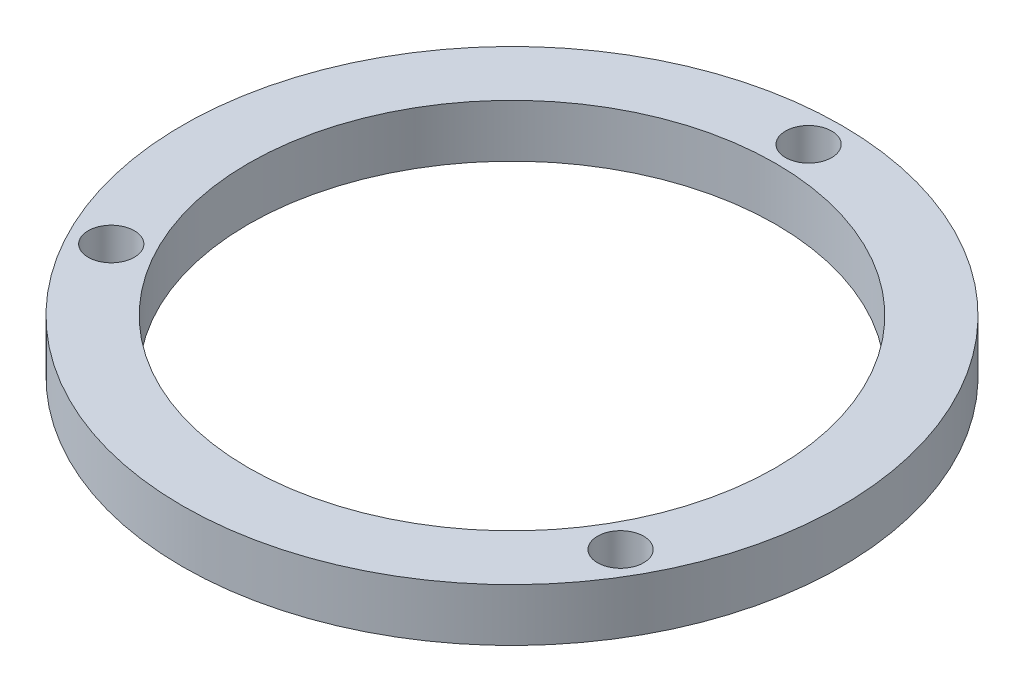
ISO-10303-21;
HEADER;
FILE_DESCRIPTION(('STEP AP214'),'2;1');
FILE_NAME('part.step','',(''),(''),'','','');
FILE_SCHEMA(('AUTOMOTIVE_DESIGN { 1 0 10303 214 1 1 1 1 }'));
ENDSEC;
DATA;
#1=APPLICATION_CONTEXT('core data for automotive mechanical design processes');
#2=APPLICATION_PROTOCOL_DEFINITION('international standard','automotive_design',2000,#1);
#3=PRODUCT_CONTEXT('',#1,'mechanical');
#4=PRODUCT('Part','Part','',(#3));
#5=PRODUCT_RELATED_PRODUCT_CATEGORY('part','',(#4));
#6=PRODUCT_DEFINITION_FORMATION('','',#4);
#7=PRODUCT_DEFINITION_CONTEXT('part definition',#1,'design');
#8=PRODUCT_DEFINITION('design','',#6,#7);
#9=PRODUCT_DEFINITION_SHAPE('','',#8);
#10=(LENGTH_UNIT() NAMED_UNIT(*) SI_UNIT(.MILLI.,.METRE.));
#11=(NAMED_UNIT(*) PLANE_ANGLE_UNIT() SI_UNIT($,.RADIAN.));
#12=(NAMED_UNIT(*) SI_UNIT($,.STERADIAN.) SOLID_ANGLE_UNIT());
#13=UNCERTAINTY_MEASURE_WITH_UNIT(LENGTH_MEASURE(1.E-05),#10,'distance_accuracy_value','');
#14=(GEOMETRIC_REPRESENTATION_CONTEXT(3) GLOBAL_UNCERTAINTY_ASSIGNED_CONTEXT((#13)) GLOBAL_UNIT_ASSIGNED_CONTEXT((#10,
#11,#12)) REPRESENTATION_CONTEXT('',''));
#15=CARTESIAN_POINT('',(0.,0.,0.));
#16=DIRECTION('',(0.,0.,1.));
#17=DIRECTION('',(1.,0.,0.));
#18=AXIS2_PLACEMENT_3D('',#15,#16,#17);
#19=CARTESIAN_POINT('',(0.,8.,0.));
#20=DIRECTION('',(0.,-1.,0.));
#21=DIRECTION('',(0.,0.,-1.));
#22=AXIS2_PLACEMENT_3D('',#19,#20,#21);
#23=CYLINDRICAL_SURFACE('',#22,50.);
#24=CARTESIAN_POINT('',(0.,8.,0.));
#25=DIRECTION('',(0.,1.,0.));
#26=DIRECTION('',(0.,0.,1.));
#27=AXIS2_PLACEMENT_3D('',#24,#25,#26);
#28=CIRCLE('',#27,50.);
#29=CARTESIAN_POINT('',(0.,8.,50.));
#30=VERTEX_POINT('',#29);
#31=EDGE_CURVE('E10',#30,#30,#28,.T.);
#32=ORIENTED_EDGE('',*,*,#31,.F.);
#33=EDGE_LOOP('',(#32));
#34=FACE_BOUND('',#33,.T.);
#35=CARTESIAN_POINT('',(0.,0.,0.));
#36=DIRECTION('',(0.,1.,0.));
#37=DIRECTION('',(0.,0.,1.));
#38=AXIS2_PLACEMENT_3D('',#35,#36,#37);
#39=CIRCLE('',#38,50.);
#40=CARTESIAN_POINT('',(0.,0.,50.));
#41=VERTEX_POINT('',#40);
#42=EDGE_CURVE('E36',#41,#41,#39,.T.);
#43=ORIENTED_EDGE('',*,*,#42,.T.);
#44=EDGE_LOOP('',(#43));
#45=FACE_BOUND('',#44,.T.);
#46=ADVANCED_FACE('F33',(#34,#45),#23,.T.);
#47=CARTESIAN_POINT('',(0.,8.,0.));
#48=DIRECTION('',(0.,1.,0.));
#49=DIRECTION('',(0.,0.,1.));
#50=AXIS2_PLACEMENT_3D('',#47,#48,#49);
#51=PLANE('',#50);
#52=CARTESIAN_POINT('',(0.,8.,-45.));
#53=DIRECTION('',(0.,1.,0.));
#54=DIRECTION('',(0.,0.,1.));
#55=AXIS2_PLACEMENT_3D('',#52,#53,#54);
#56=CIRCLE('',#55,3.5);
#57=CARTESIAN_POINT('',(0.,8.,-41.5));
#58=VERTEX_POINT('',#57);
#59=EDGE_CURVE('E62',#58,#58,#56,.T.);
#60=ORIENTED_EDGE('',*,*,#59,.F.);
#61=EDGE_LOOP('',(#60));
#62=FACE_BOUND('',#61,.T.);
#63=CARTESIAN_POINT('',(-39.8015092901486,8.,20.9961867544136));
#64=DIRECTION('',(0.,1.,0.));
#65=DIRECTION('',(0.,0.,1.));
#66=AXIS2_PLACEMENT_3D('',#63,#64,#65);
#67=CIRCLE('',#66,3.5);
#68=CARTESIAN_POINT('',(-39.8015092901486,8.,24.4961867544136));
#69=VERTEX_POINT('',#68);
#70=EDGE_CURVE('E56',#69,#69,#67,.T.);
#71=ORIENTED_EDGE('',*,*,#70,.F.);
#72=EDGE_LOOP('',(#71));
#73=FACE_BOUND('',#72,.T.);
#74=CARTESIAN_POINT('',(38.9711431702997,8.,22.5));
#75=DIRECTION('',(0.,1.,0.));
#76=DIRECTION('',(0.,0.,1.));
#77=AXIS2_PLACEMENT_3D('',#74,#75,#76);
#78=CIRCLE('',#77,3.5);
#79=CARTESIAN_POINT('',(38.9711431702997,8.,26.));
#80=VERTEX_POINT('',#79);
#81=EDGE_CURVE('E50',#80,#80,#78,.T.);
#82=ORIENTED_EDGE('',*,*,#81,.F.);
#83=EDGE_LOOP('',(#82));
#84=FACE_BOUND('',#83,.T.);
#85=CARTESIAN_POINT('',(0.,8.,0.));
#86=DIRECTION('',(0.,1.,0.));
#87=DIRECTION('',(0.,0.,1.));
#88=AXIS2_PLACEMENT_3D('',#85,#86,#87);
#89=CIRCLE('',#88,40.);
#90=CARTESIAN_POINT('',(0.,8.,40.));
#91=VERTEX_POINT('',#90);
#92=EDGE_CURVE('E43',#91,#91,#89,.T.);
#93=ORIENTED_EDGE('',*,*,#92,.F.);
#94=EDGE_LOOP('',(#93));
#95=FACE_BOUND('',#94,.T.);
#96=ORIENTED_EDGE('',*,*,#31,.T.);
#97=EDGE_LOOP('',(#96));
#98=FACE_BOUND('',#97,.T.);
#99=ADVANCED_FACE('F75',(#62,#73,#84,#95,#98),#51,.T.);
#100=CARTESIAN_POINT('',(0.,0.,0.));
#101=DIRECTION('',(0.,1.,0.));
#102=DIRECTION('',(0.,0.,1.));
#103=AXIS2_PLACEMENT_3D('',#100,#101,#102);
#104=PLANE('',#103);
#105=CARTESIAN_POINT('',(0.,0.,-45.));
#106=DIRECTION('',(0.,-1.,0.));
#107=DIRECTION('',(0.,0.,-1.));
#108=AXIS2_PLACEMENT_3D('',#105,#106,#107);
#109=CIRCLE('',#108,3.5);
#110=CARTESIAN_POINT('',(0.,0.,-48.5));
#111=VERTEX_POINT('',#110);
#112=EDGE_CURVE('E65',#111,#111,#109,.T.);
#113=ORIENTED_EDGE('',*,*,#112,.F.);
#114=EDGE_LOOP('',(#113));
#115=FACE_BOUND('',#114,.T.);
#116=CARTESIAN_POINT('',(-39.8015092901486,0.,20.9961867544136));
#117=DIRECTION('',(0.,-1.,0.));
#118=DIRECTION('',(0.,0.,-1.));
#119=AXIS2_PLACEMENT_3D('',#116,#117,#118);
#120=CIRCLE('',#119,3.5);
#121=CARTESIAN_POINT('',(-39.8015092901486,0.,17.4961867544136));
#122=VERTEX_POINT('',#121);
#123=EDGE_CURVE('E59',#122,#122,#120,.T.);
#124=ORIENTED_EDGE('',*,*,#123,.F.);
#125=EDGE_LOOP('',(#124));
#126=FACE_BOUND('',#125,.T.);
#127=CARTESIAN_POINT('',(38.9711431702997,0.,22.5));
#128=DIRECTION('',(0.,-1.,0.));
#129=DIRECTION('',(0.,0.,-1.));
#130=AXIS2_PLACEMENT_3D('',#127,#128,#129);
#131=CIRCLE('',#130,3.5);
#132=CARTESIAN_POINT('',(38.9711431702997,0.,19.));
#133=VERTEX_POINT('',#132);
#134=EDGE_CURVE('E53',#133,#133,#131,.T.);
#135=ORIENTED_EDGE('',*,*,#134,.F.);
#136=EDGE_LOOP('',(#135));
#137=FACE_BOUND('',#136,.T.);
#138=CARTESIAN_POINT('',(0.,0.,0.));
#139=DIRECTION('',(0.,-1.,0.));
#140=DIRECTION('',(0.,0.,-1.));
#141=AXIS2_PLACEMENT_3D('',#138,#139,#140);
#142=CIRCLE('',#141,40.);
#143=CARTESIAN_POINT('',(0.,0.,-40.));
#144=VERTEX_POINT('',#143);
#145=EDGE_CURVE('E47',#144,#144,#142,.T.);
#146=ORIENTED_EDGE('',*,*,#145,.F.);
#147=EDGE_LOOP('',(#146));
#148=FACE_BOUND('',#147,.T.);
#149=ORIENTED_EDGE('',*,*,#42,.F.);
#150=EDGE_LOOP('',(#149));
#151=FACE_BOUND('',#150,.T.);
#152=ADVANCED_FACE('F71',(#115,#126,#137,#148,#151),#104,.F.);
#153=CARTESIAN_POINT('',(0.,10.,0.));
#154=DIRECTION('',(0.,-1.,0.));
#155=DIRECTION('',(0.,0.,-1.));
#156=AXIS2_PLACEMENT_3D('',#153,#154,#155);
#157=CYLINDRICAL_SURFACE('',#156,40.);
#158=ORIENTED_EDGE('',*,*,#92,.T.);
#159=EDGE_LOOP('',(#158));
#160=FACE_BOUND('',#159,.T.);
#161=ORIENTED_EDGE('',*,*,#145,.T.);
#162=EDGE_LOOP('',(#161));
#163=FACE_BOUND('',#162,.T.);
#164=ADVANCED_FACE('F74',(#160,#163),#157,.F.);
#165=CARTESIAN_POINT('',(38.9711431702997,10.,22.5));
#166=DIRECTION('',(0.,-1.,0.));
#167=DIRECTION('',(0.,0.,-1.));
#168=AXIS2_PLACEMENT_3D('',#165,#166,#167);
#169=CYLINDRICAL_SURFACE('',#168,3.5);
#170=ORIENTED_EDGE('',*,*,#81,.T.);
#171=EDGE_LOOP('',(#170));
#172=FACE_BOUND('',#171,.T.);
#173=ORIENTED_EDGE('',*,*,#134,.T.);
#174=EDGE_LOOP('',(#173));
#175=FACE_BOUND('',#174,.T.);
#176=ADVANCED_FACE('F98',(#172,#175),#169,.F.);
#177=CARTESIAN_POINT('',(-39.8015092901486,10.,20.9961867544136));
#178=DIRECTION('',(0.,-1.,0.));
#179=DIRECTION('',(0.,0.,-1.));
#180=AXIS2_PLACEMENT_3D('',#177,#178,#179);
#181=CYLINDRICAL_SURFACE('',#180,3.5);
#182=ORIENTED_EDGE('',*,*,#70,.T.);
#183=EDGE_LOOP('',(#182));
#184=FACE_BOUND('',#183,.T.);
#185=ORIENTED_EDGE('',*,*,#123,.T.);
#186=EDGE_LOOP('',(#185));
#187=FACE_BOUND('',#186,.T.);
#188=ADVANCED_FACE('F102',(#184,#187),#181,.F.);
#189=CARTESIAN_POINT('',(0.,10.,-45.));
#190=DIRECTION('',(0.,-1.,0.));
#191=DIRECTION('',(0.,0.,-1.));
#192=AXIS2_PLACEMENT_3D('',#189,#190,#191);
#193=CYLINDRICAL_SURFACE('',#192,3.5);
#194=ORIENTED_EDGE('',*,*,#59,.T.);
#195=EDGE_LOOP('',(#194));
#196=FACE_BOUND('',#195,.T.);
#197=ORIENTED_EDGE('',*,*,#112,.T.);
#198=EDGE_LOOP('',(#197));
#199=FACE_BOUND('',#198,.T.);
#200=ADVANCED_FACE('F69',(#196,#199),#193,.F.);
#201=CLOSED_SHELL('',(#46,#99,#152,#164,#176,#188,#200));
#202=MANIFOLD_SOLID_BREP('B2',#201);
#203=ADVANCED_BREP_SHAPE_REPRESENTATION('',(#18,#202),#14);
#204=SHAPE_DEFINITION_REPRESENTATION(#9,#203);
ENDSEC;
END-ISO-10303-21;
